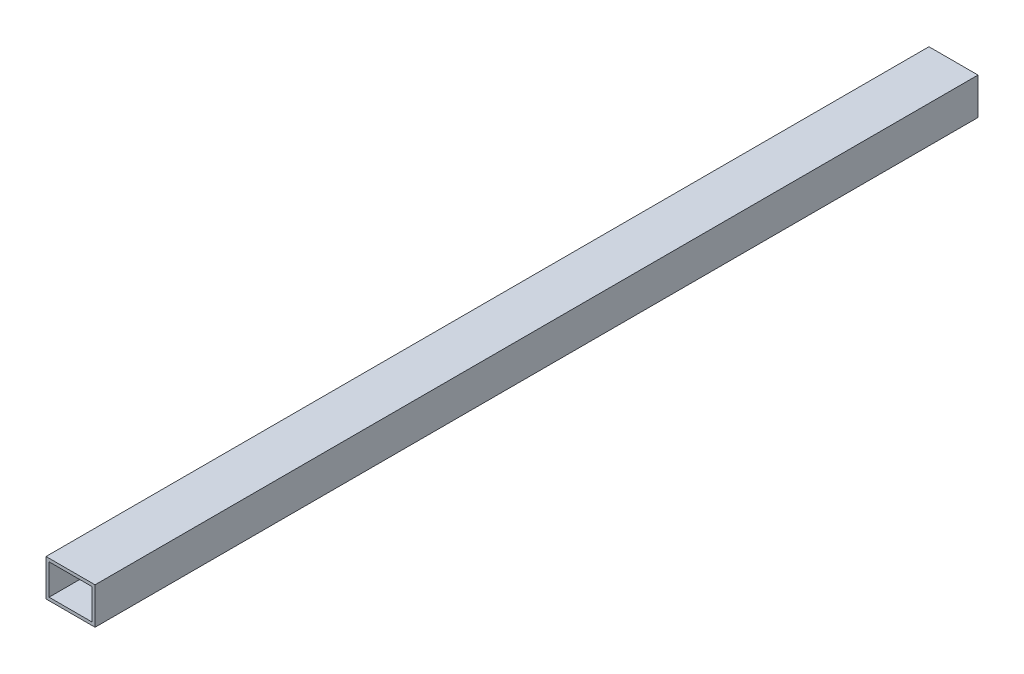
ISO-10303-21;
HEADER;
FILE_DESCRIPTION(('STEP AP214'),'2;1');
FILE_NAME('part.step','',(''),(''),'','','');
FILE_SCHEMA(('AUTOMOTIVE_DESIGN { 1 0 10303 214 1 1 1 1 }'));
ENDSEC;
DATA;
#1=APPLICATION_CONTEXT('core data for automotive mechanical design processes');
#2=APPLICATION_PROTOCOL_DEFINITION('international standard','automotive_design',2000,#1);
#3=PRODUCT_CONTEXT('',#1,'mechanical');
#4=PRODUCT('Part','Part','',(#3));
#5=PRODUCT_RELATED_PRODUCT_CATEGORY('part','',(#4));
#6=PRODUCT_DEFINITION_FORMATION('','',#4);
#7=PRODUCT_DEFINITION_CONTEXT('part definition',#1,'design');
#8=PRODUCT_DEFINITION('design','',#6,#7);
#9=PRODUCT_DEFINITION_SHAPE('','',#8);
#10=(LENGTH_UNIT() NAMED_UNIT(*) SI_UNIT(.MILLI.,.METRE.));
#11=(NAMED_UNIT(*) PLANE_ANGLE_UNIT() SI_UNIT($,.RADIAN.));
#12=(NAMED_UNIT(*) SI_UNIT($,.STERADIAN.) SOLID_ANGLE_UNIT());
#13=UNCERTAINTY_MEASURE_WITH_UNIT(LENGTH_MEASURE(1.E-05),#10,'distance_accuracy_value','');
#14=(GEOMETRIC_REPRESENTATION_CONTEXT(3) GLOBAL_UNCERTAINTY_ASSIGNED_CONTEXT((#13)) GLOBAL_UNIT_ASSIGNED_CONTEXT((#10,
#11,#12)) REPRESENTATION_CONTEXT('',''));
#15=CARTESIAN_POINT('',(0.,0.,0.));
#16=DIRECTION('',(0.,0.,1.));
#17=DIRECTION('',(1.,0.,0.));
#18=AXIS2_PLACEMENT_3D('',#15,#16,#17);
#19=CARTESIAN_POINT('',(0.,0.,457.2));
#20=DIRECTION('',(0.,0.,1.));
#21=DIRECTION('',(1.,0.,0.));
#22=AXIS2_PLACEMENT_3D('',#19,#20,#21);
#23=PLANE('',#22);
#24=DIRECTION('',(0.,-1.,0.));
#25=VECTOR('',#24,1.);
#26=CARTESIAN_POINT('',(-25.4,-19.05,457.2));
#27=LINE('',#26,#25);
#28=CARTESIAN_POINT('',(-25.4,19.05,457.2));
#29=VERTEX_POINT('',#28);
#30=CARTESIAN_POINT('',(-25.4,-19.05,457.2));
#31=VERTEX_POINT('',#30);
#32=EDGE_CURVE('E108',#29,#31,#27,.T.);
#33=ORIENTED_EDGE('',*,*,#32,.T.);
#34=DIRECTION('',(1.,0.,0.));
#35=VECTOR('',#34,1.);
#36=CARTESIAN_POINT('',(25.4,-19.05,457.2));
#37=LINE('',#36,#35);
#38=CARTESIAN_POINT('',(25.4,-19.05,457.2));
#39=VERTEX_POINT('',#38);
#40=EDGE_CURVE('E151',#31,#39,#37,.T.);
#41=ORIENTED_EDGE('',*,*,#40,.T.);
#42=DIRECTION('',(0.,1.,0.));
#43=VECTOR('',#42,1.);
#44=CARTESIAN_POINT('',(25.4,-19.05,457.2));
#45=LINE('',#44,#43);
#46=CARTESIAN_POINT('',(25.4,19.05,457.2));
#47=VERTEX_POINT('',#46);
#48=EDGE_CURVE('E153',#39,#47,#45,.T.);
#49=ORIENTED_EDGE('',*,*,#48,.T.);
#50=DIRECTION('',(-1.,0.,0.));
#51=VECTOR('',#50,1.);
#52=CARTESIAN_POINT('',(25.4,19.05,457.2));
#53=LINE('',#52,#51);
#54=EDGE_CURVE('E55',#47,#29,#53,.T.);
#55=ORIENTED_EDGE('',*,*,#54,.T.);
#56=EDGE_LOOP('',(#33,#41,#49,#55));
#57=FACE_BOUND('',#56,.T.);
#58=DIRECTION('',(1.,0.,0.));
#59=VECTOR('',#58,1.);
#60=CARTESIAN_POINT('',(22.225,-15.875,457.2));
#61=LINE('',#60,#59);
#62=CARTESIAN_POINT('',(-22.225,-15.875,457.2));
#63=VERTEX_POINT('',#62);
#64=CARTESIAN_POINT('',(22.225,-15.875,457.2));
#65=VERTEX_POINT('',#64);
#66=EDGE_CURVE('E140',#63,#65,#61,.T.);
#67=ORIENTED_EDGE('',*,*,#66,.F.);
#68=DIRECTION('',(0.,-1.,0.));
#69=VECTOR('',#68,1.);
#70=CARTESIAN_POINT('',(-22.225,-15.875,457.2));
#71=LINE('',#70,#69);
#72=CARTESIAN_POINT('',(-22.225,15.875,457.2));
#73=VERTEX_POINT('',#72);
#74=EDGE_CURVE('E105',#73,#63,#71,.T.);
#75=ORIENTED_EDGE('',*,*,#74,.F.);
#76=DIRECTION('',(-1.,0.,0.));
#77=VECTOR('',#76,1.);
#78=CARTESIAN_POINT('',(22.225,15.875,457.2));
#79=LINE('',#78,#77);
#80=CARTESIAN_POINT('',(22.225,15.875,457.2));
#81=VERTEX_POINT('',#80);
#82=EDGE_CURVE('E144',#81,#73,#79,.T.);
#83=ORIENTED_EDGE('',*,*,#82,.F.);
#84=DIRECTION('',(0.,1.,0.));
#85=VECTOR('',#84,1.);
#86=CARTESIAN_POINT('',(22.225,-15.875,457.2));
#87=LINE('',#86,#85);
#88=EDGE_CURVE('E142',#65,#81,#87,.T.);
#89=ORIENTED_EDGE('',*,*,#88,.F.);
#90=EDGE_LOOP('',(#67,#75,#83,#89));
#91=FACE_BOUND('',#90,.T.);
#92=ADVANCED_FACE('F32',(#57,#91),#23,.T.);
#93=CARTESIAN_POINT('',(-25.4,-19.05,457.2));
#94=DIRECTION('',(1.,0.,0.));
#95=DIRECTION('',(0.,0.,-1.));
#96=AXIS2_PLACEMENT_3D('',#93,#94,#95);
#97=PLANE('',#96);
#98=DIRECTION('',(0.,0.,-1.));
#99=VECTOR('',#98,1.);
#100=CARTESIAN_POINT('',(-25.4,19.05,457.2));
#101=LINE('',#100,#99);
#102=CARTESIAN_POINT('',(-25.4,19.05,-457.2));
#103=VERTEX_POINT('',#102);
#104=EDGE_CURVE('E156',#29,#103,#101,.T.);
#105=ORIENTED_EDGE('',*,*,#104,.T.);
#106=DIRECTION('',(0.,-1.,0.));
#107=VECTOR('',#106,1.);
#108=CARTESIAN_POINT('',(-25.4,-19.05,-457.2));
#109=LINE('',#108,#107);
#110=CARTESIAN_POINT('',(-25.4,-19.05,-457.2));
#111=VERTEX_POINT('',#110);
#112=EDGE_CURVE('E127',#103,#111,#109,.T.);
#113=ORIENTED_EDGE('',*,*,#112,.T.);
#114=DIRECTION('',(0.,0.,-1.));
#115=VECTOR('',#114,1.);
#116=CARTESIAN_POINT('',(-25.4,-19.05,457.2));
#117=LINE('',#116,#115);
#118=EDGE_CURVE('E11',#31,#111,#117,.T.);
#119=ORIENTED_EDGE('',*,*,#118,.F.);
#120=ORIENTED_EDGE('',*,*,#32,.F.);
#121=EDGE_LOOP('',(#105,#113,#119,#120));
#122=FACE_BOUND('',#121,.T.);
#123=ADVANCED_FACE('F34',(#122),#97,.F.);
#124=CARTESIAN_POINT('',(25.4,-19.05,457.2));
#125=DIRECTION('',(0.,1.,0.));
#126=DIRECTION('',(0.,0.,1.));
#127=AXIS2_PLACEMENT_3D('',#124,#125,#126);
#128=PLANE('',#127);
#129=ORIENTED_EDGE('',*,*,#118,.T.);
#130=DIRECTION('',(1.,0.,0.));
#131=VECTOR('',#130,1.);
#132=CARTESIAN_POINT('',(25.4,-19.05,-457.2));
#133=LINE('',#132,#131);
#134=CARTESIAN_POINT('',(25.4,-19.05,-457.2));
#135=VERTEX_POINT('',#134);
#136=EDGE_CURVE('E130',#111,#135,#133,.T.);
#137=ORIENTED_EDGE('',*,*,#136,.T.);
#138=DIRECTION('',(0.,0.,-1.));
#139=VECTOR('',#138,1.);
#140=CARTESIAN_POINT('',(25.4,-19.05,457.2));
#141=LINE('',#140,#139);
#142=EDGE_CURVE('E40',#39,#135,#141,.T.);
#143=ORIENTED_EDGE('',*,*,#142,.F.);
#144=ORIENTED_EDGE('',*,*,#40,.F.);
#145=EDGE_LOOP('',(#129,#137,#143,#144));
#146=FACE_BOUND('',#145,.T.);
#147=ADVANCED_FACE('F169',(#146),#128,.F.);
#148=CARTESIAN_POINT('',(25.4,-19.05,457.2));
#149=DIRECTION('',(-1.,0.,0.));
#150=DIRECTION('',(0.,0.,1.));
#151=AXIS2_PLACEMENT_3D('',#148,#149,#150);
#152=PLANE('',#151);
#153=ORIENTED_EDGE('',*,*,#142,.T.);
#154=DIRECTION('',(0.,1.,0.));
#155=VECTOR('',#154,1.);
#156=CARTESIAN_POINT('',(25.4,-19.05,-457.2));
#157=LINE('',#156,#155);
#158=CARTESIAN_POINT('',(25.4,19.05,-457.2));
#159=VERTEX_POINT('',#158);
#160=EDGE_CURVE('E133',#135,#159,#157,.T.);
#161=ORIENTED_EDGE('',*,*,#160,.T.);
#162=DIRECTION('',(0.,0.,-1.));
#163=VECTOR('',#162,1.);
#164=CARTESIAN_POINT('',(25.4,19.05,457.2));
#165=LINE('',#164,#163);
#166=EDGE_CURVE('E158',#47,#159,#165,.T.);
#167=ORIENTED_EDGE('',*,*,#166,.F.);
#168=ORIENTED_EDGE('',*,*,#48,.F.);
#169=EDGE_LOOP('',(#153,#161,#167,#168));
#170=FACE_BOUND('',#169,.T.);
#171=ADVANCED_FACE('F163',(#170),#152,.F.);
#172=CARTESIAN_POINT('',(25.4,19.05,457.2));
#173=DIRECTION('',(0.,-1.,0.));
#174=DIRECTION('',(0.,0.,-1.));
#175=AXIS2_PLACEMENT_3D('',#172,#173,#174);
#176=PLANE('',#175);
#177=ORIENTED_EDGE('',*,*,#166,.T.);
#178=DIRECTION('',(-1.,0.,0.));
#179=VECTOR('',#178,1.);
#180=CARTESIAN_POINT('',(25.4,19.05,-457.2));
#181=LINE('',#180,#179);
#182=EDGE_CURVE('E136',#159,#103,#181,.T.);
#183=ORIENTED_EDGE('',*,*,#182,.T.);
#184=ORIENTED_EDGE('',*,*,#104,.F.);
#185=ORIENTED_EDGE('',*,*,#54,.F.);
#186=EDGE_LOOP('',(#177,#183,#184,#185));
#187=FACE_BOUND('',#186,.T.);
#188=ADVANCED_FACE('F174',(#187),#176,.F.);
#189=CARTESIAN_POINT('',(-22.225,-15.875,457.2));
#190=DIRECTION('',(1.,0.,0.));
#191=DIRECTION('',(0.,0.,-1.));
#192=AXIS2_PLACEMENT_3D('',#189,#190,#191);
#193=PLANE('',#192);
#194=DIRECTION('',(0.,0.,-1.));
#195=VECTOR('',#194,1.);
#196=CARTESIAN_POINT('',(-22.225,-15.875,457.2));
#197=LINE('',#196,#195);
#198=CARTESIAN_POINT('',(-22.225,-15.875,-457.2));
#199=VERTEX_POINT('',#198);
#200=EDGE_CURVE('E97',#63,#199,#197,.T.);
#201=ORIENTED_EDGE('',*,*,#200,.T.);
#202=DIRECTION('',(0.,-1.,0.));
#203=VECTOR('',#202,1.);
#204=CARTESIAN_POINT('',(-22.225,-15.875,-457.2));
#205=LINE('',#204,#203);
#206=CARTESIAN_POINT('',(-22.225,15.875,-457.2));
#207=VERTEX_POINT('',#206);
#208=EDGE_CURVE('E102',#207,#199,#205,.T.);
#209=ORIENTED_EDGE('',*,*,#208,.F.);
#210=DIRECTION('',(0.,0.,-1.));
#211=VECTOR('',#210,1.);
#212=CARTESIAN_POINT('',(-22.225,15.875,457.2));
#213=LINE('',#212,#211);
#214=EDGE_CURVE('E146',#73,#207,#213,.T.);
#215=ORIENTED_EDGE('',*,*,#214,.F.);
#216=ORIENTED_EDGE('',*,*,#74,.T.);
#217=EDGE_LOOP('',(#201,#209,#215,#216));
#218=FACE_BOUND('',#217,.T.);
#219=ADVANCED_FACE('F99',(#218),#193,.T.);
#220=CARTESIAN_POINT('',(22.225,-15.875,457.2));
#221=DIRECTION('',(0.,1.,0.));
#222=DIRECTION('',(-1.,0.,0.));
#223=AXIS2_PLACEMENT_3D('',#220,#221,#222);
#224=PLANE('',#223);
#225=DIRECTION('',(0.,0.,-1.));
#226=VECTOR('',#225,1.);
#227=CARTESIAN_POINT('',(22.225,-15.875,457.2));
#228=LINE('',#227,#226);
#229=CARTESIAN_POINT('',(22.225,-15.875,-457.2));
#230=VERTEX_POINT('',#229);
#231=EDGE_CURVE('E109',#65,#230,#228,.T.);
#232=ORIENTED_EDGE('',*,*,#231,.T.);
#233=DIRECTION('',(1.,0.,0.));
#234=VECTOR('',#233,1.);
#235=CARTESIAN_POINT('',(22.225,-15.875,-457.2));
#236=LINE('',#235,#234);
#237=EDGE_CURVE('E112',#199,#230,#236,.T.);
#238=ORIENTED_EDGE('',*,*,#237,.F.);
#239=ORIENTED_EDGE('',*,*,#200,.F.);
#240=ORIENTED_EDGE('',*,*,#66,.T.);
#241=EDGE_LOOP('',(#232,#238,#239,#240));
#242=FACE_BOUND('',#241,.T.);
#243=ADVANCED_FACE('F113',(#242),#224,.T.);
#244=CARTESIAN_POINT('',(22.225,-15.875,457.2));
#245=DIRECTION('',(-1.,0.,0.));
#246=DIRECTION('',(0.,-1.,0.));
#247=AXIS2_PLACEMENT_3D('',#244,#245,#246);
#248=PLANE('',#247);
#249=DIRECTION('',(0.,0.,-1.));
#250=VECTOR('',#249,1.);
#251=CARTESIAN_POINT('',(22.225,15.875,457.2));
#252=LINE('',#251,#250);
#253=CARTESIAN_POINT('',(22.225,15.875,-457.2));
#254=VERTEX_POINT('',#253);
#255=EDGE_CURVE('E47',#81,#254,#252,.T.);
#256=ORIENTED_EDGE('',*,*,#255,.T.);
#257=DIRECTION('',(0.,1.,0.));
#258=VECTOR('',#257,1.);
#259=CARTESIAN_POINT('',(22.225,-15.875,-457.2));
#260=LINE('',#259,#258);
#261=EDGE_CURVE('E118',#230,#254,#260,.T.);
#262=ORIENTED_EDGE('',*,*,#261,.F.);
#263=ORIENTED_EDGE('',*,*,#231,.F.);
#264=ORIENTED_EDGE('',*,*,#88,.T.);
#265=EDGE_LOOP('',(#256,#262,#263,#264));
#266=FACE_BOUND('',#265,.T.);
#267=ADVANCED_FACE('F192',(#266),#248,.T.);
#268=CARTESIAN_POINT('',(22.225,15.875,457.2));
#269=DIRECTION('',(0.,-1.,0.));
#270=DIRECTION('',(0.,0.,-1.));
#271=AXIS2_PLACEMENT_3D('',#268,#269,#270);
#272=PLANE('',#271);
#273=ORIENTED_EDGE('',*,*,#214,.T.);
#274=DIRECTION('',(-1.,0.,0.));
#275=VECTOR('',#274,1.);
#276=CARTESIAN_POINT('',(22.225,15.875,-457.2));
#277=LINE('',#276,#275);
#278=EDGE_CURVE('E122',#254,#207,#277,.T.);
#279=ORIENTED_EDGE('',*,*,#278,.F.);
#280=ORIENTED_EDGE('',*,*,#255,.F.);
#281=ORIENTED_EDGE('',*,*,#82,.T.);
#282=EDGE_LOOP('',(#273,#279,#280,#281));
#283=FACE_BOUND('',#282,.T.);
#284=ADVANCED_FACE('F195',(#283),#272,.T.);
#285=CARTESIAN_POINT('',(0.,0.,-457.2));
#286=DIRECTION('',(0.,0.,1.));
#287=DIRECTION('',(1.,0.,0.));
#288=AXIS2_PLACEMENT_3D('',#285,#286,#287);
#289=PLANE('',#288);
#290=ORIENTED_EDGE('',*,*,#278,.T.);
#291=ORIENTED_EDGE('',*,*,#208,.T.);
#292=ORIENTED_EDGE('',*,*,#237,.T.);
#293=ORIENTED_EDGE('',*,*,#261,.T.);
#294=EDGE_LOOP('',(#290,#291,#292,#293));
#295=FACE_BOUND('',#294,.T.);
#296=ORIENTED_EDGE('',*,*,#112,.F.);
#297=ORIENTED_EDGE('',*,*,#182,.F.);
#298=ORIENTED_EDGE('',*,*,#160,.F.);
#299=ORIENTED_EDGE('',*,*,#136,.F.);
#300=EDGE_LOOP('',(#296,#297,#298,#299));
#301=FACE_BOUND('',#300,.T.);
#302=ADVANCED_FACE('F120',(#295,#301),#289,.F.);
#303=CLOSED_SHELL('',(#92,#123,#147,#171,#188,#219,#243,#267,#284,#302));
#304=MANIFOLD_SOLID_BREP('B2',#303);
#305=ADVANCED_BREP_SHAPE_REPRESENTATION('',(#18,#304),#14);
#306=SHAPE_DEFINITION_REPRESENTATION(#9,#305);
ENDSEC;
END-ISO-10303-21;
